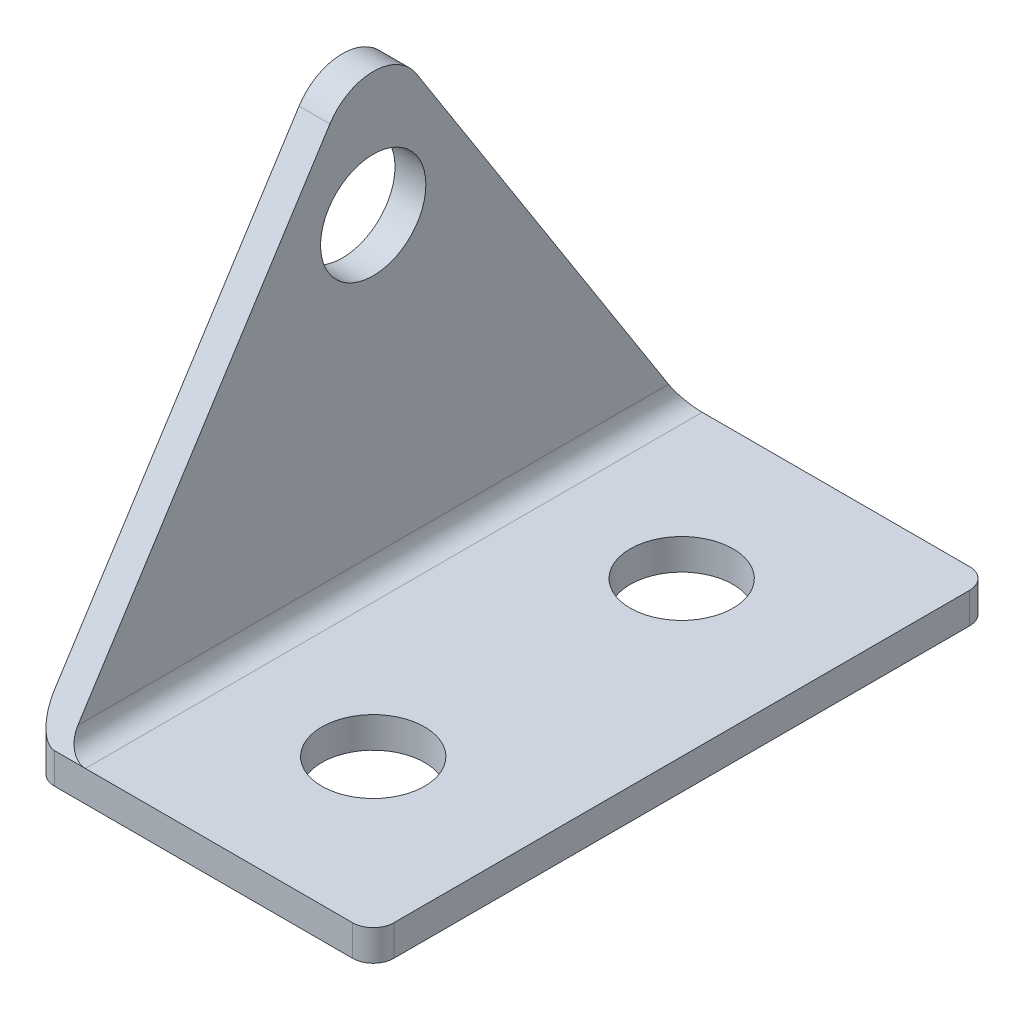
ISO-10303-21;
HEADER;
FILE_DESCRIPTION(('STEP AP214'),'2;1');
FILE_NAME('part.step','',(''),(''),'','','');
FILE_SCHEMA(('AUTOMOTIVE_DESIGN { 1 0 10303 214 1 1 1 1 }'));
ENDSEC;
DATA;
#1=APPLICATION_CONTEXT('core data for automotive mechanical design processes');
#2=APPLICATION_PROTOCOL_DEFINITION('international standard','automotive_design',2000,#1);
#3=PRODUCT_CONTEXT('',#1,'mechanical');
#4=PRODUCT('Part','Part','',(#3));
#5=PRODUCT_RELATED_PRODUCT_CATEGORY('part','',(#4));
#6=PRODUCT_DEFINITION_FORMATION('','',#4);
#7=PRODUCT_DEFINITION_CONTEXT('part definition',#1,'design');
#8=PRODUCT_DEFINITION('design','',#6,#7);
#9=PRODUCT_DEFINITION_SHAPE('','',#8);
#10=(LENGTH_UNIT() NAMED_UNIT(*) SI_UNIT(.MILLI.,.METRE.));
#11=(NAMED_UNIT(*) PLANE_ANGLE_UNIT() SI_UNIT($,.RADIAN.));
#12=(NAMED_UNIT(*) SI_UNIT($,.STERADIAN.) SOLID_ANGLE_UNIT());
#13=UNCERTAINTY_MEASURE_WITH_UNIT(LENGTH_MEASURE(1.E-05),#10,'distance_accuracy_value','');
#14=(GEOMETRIC_REPRESENTATION_CONTEXT(3) GLOBAL_UNCERTAINTY_ASSIGNED_CONTEXT((#13)) GLOBAL_UNIT_ASSIGNED_CONTEXT((#10,
#11,#12)) REPRESENTATION_CONTEXT('',''));
#15=CARTESIAN_POINT('',(0.,0.,0.));
#16=DIRECTION('',(0.,0.,1.));
#17=DIRECTION('',(1.,0.,0.));
#18=AXIS2_PLACEMENT_3D('',#15,#16,#17);
#19=CARTESIAN_POINT('',(0.,0.,38.1));
#20=DIRECTION('',(0.,1.,0.));
#21=DIRECTION('',(0.,0.,1.));
#22=AXIS2_PLACEMENT_3D('',#19,#20,#21);
#23=PLANE('',#22);
#24=CARTESIAN_POINT('',(22.86,0.,19.05));
#25=DIRECTION('',(0.,1.,0.));
#26=DIRECTION('',(0.,0.,1.));
#27=AXIS2_PLACEMENT_3D('',#24,#25,#26);
#28=CIRCLE('',#27,6.35);
#29=CARTESIAN_POINT('',(16.51,0.,19.05));
#30=VERTEX_POINT('',#29);
#31=EDGE_CURVE('E321',#30,#30,#28,.T.);
#32=ORIENTED_EDGE('',*,*,#31,.T.);
#33=EDGE_LOOP('',(#32));
#34=FACE_BOUND('',#33,.T.);
#35=CARTESIAN_POINT('',(22.86,0.,-19.05));
#36=DIRECTION('',(0.,1.,0.));
#37=DIRECTION('',(0.,0.,1.));
#38=AXIS2_PLACEMENT_3D('',#35,#36,#37);
#39=CIRCLE('',#38,6.35);
#40=CARTESIAN_POINT('',(16.51,0.,-19.05));
#41=VERTEX_POINT('',#40);
#42=EDGE_CURVE('E325',#41,#41,#39,.T.);
#43=ORIENTED_EDGE('',*,*,#42,.T.);
#44=EDGE_LOOP('',(#43));
#45=FACE_BOUND('',#44,.T.);
#46=DIRECTION('',(0.,0.,-1.));
#47=VECTOR('',#46,1.);
#48=CARTESIAN_POINT('',(0.,0.,38.1));
#49=LINE('',#48,#47);
#50=CARTESIAN_POINT('',(0.,0.,35.56));
#51=VERTEX_POINT('',#50);
#52=CARTESIAN_POINT('',(0.,0.,-35.56));
#53=VERTEX_POINT('',#52);
#54=EDGE_CURVE('E211',#51,#53,#49,.T.);
#55=ORIENTED_EDGE('',*,*,#54,.T.);
#56=CARTESIAN_POINT('',(2.54,0.,-35.56));
#57=DIRECTION('',(0.,1.,0.));
#58=DIRECTION('',(0.,0.,1.));
#59=AXIS2_PLACEMENT_3D('',#56,#57,#58);
#60=CIRCLE('',#59,2.54);
#61=CARTESIAN_POINT('',(2.54,0.,-38.1));
#62=VERTEX_POINT('',#61);
#63=EDGE_CURVE('E244',#53,#62,#60,.F.);
#64=ORIENTED_EDGE('',*,*,#63,.T.);
#65=DIRECTION('',(1.,0.,0.));
#66=VECTOR('',#65,1.);
#67=CARTESIAN_POINT('',(0.,0.,-38.1));
#68=LINE('',#67,#66);
#69=CARTESIAN_POINT('',(39.37,0.,-38.1));
#70=VERTEX_POINT('',#69);
#71=EDGE_CURVE('E201',#62,#70,#68,.T.);
#72=ORIENTED_EDGE('',*,*,#71,.T.);
#73=CARTESIAN_POINT('',(39.37,0.,-35.56));
#74=DIRECTION('',(0.,1.,0.));
#75=DIRECTION('',(0.,0.,1.));
#76=AXIS2_PLACEMENT_3D('',#73,#74,#75);
#77=CIRCLE('',#76,2.54);
#78=CARTESIAN_POINT('',(41.91,0.,-35.56));
#79=VERTEX_POINT('',#78);
#80=EDGE_CURVE('E238',#70,#79,#77,.F.);
#81=ORIENTED_EDGE('',*,*,#80,.T.);
#82=DIRECTION('',(0.,0.,1.));
#83=VECTOR('',#82,1.);
#84=CARTESIAN_POINT('',(41.91,0.,38.1));
#85=LINE('',#84,#83);
#86=CARTESIAN_POINT('',(41.91,0.,35.56));
#87=VERTEX_POINT('',#86);
#88=EDGE_CURVE('E181',#79,#87,#85,.T.);
#89=ORIENTED_EDGE('',*,*,#88,.T.);
#90=CARTESIAN_POINT('',(39.37,0.,35.56));
#91=DIRECTION('',(0.,1.,0.));
#92=DIRECTION('',(0.,0.,1.));
#93=AXIS2_PLACEMENT_3D('',#90,#91,#92);
#94=CIRCLE('',#93,2.54);
#95=CARTESIAN_POINT('',(39.37,0.,38.1));
#96=VERTEX_POINT('',#95);
#97=EDGE_CURVE('E235',#87,#96,#94,.F.);
#98=ORIENTED_EDGE('',*,*,#97,.T.);
#99=DIRECTION('',(1.,0.,0.));
#100=VECTOR('',#99,1.);
#101=CARTESIAN_POINT('',(0.,0.,38.1));
#102=LINE('',#101,#100);
#103=CARTESIAN_POINT('',(2.54,0.,38.1));
#104=VERTEX_POINT('',#103);
#105=EDGE_CURVE('E202',#104,#96,#102,.T.);
#106=ORIENTED_EDGE('',*,*,#105,.F.);
#107=CARTESIAN_POINT('',(2.54,0.,35.56));
#108=DIRECTION('',(0.,1.,0.));
#109=DIRECTION('',(0.,0.,1.));
#110=AXIS2_PLACEMENT_3D('',#107,#108,#109);
#111=CIRCLE('',#110,2.54);
#112=EDGE_CURVE('E241',#104,#51,#111,.F.);
#113=ORIENTED_EDGE('',*,*,#112,.T.);
#114=EDGE_LOOP('',(#55,#64,#72,#81,#89,#98,#106,#113));
#115=FACE_BOUND('',#114,.T.);
#116=ADVANCED_FACE('F65',(#34,#45,#115),#23,.F.);
#117=CARTESIAN_POINT('',(63.5,3.81,38.1));
#118=DIRECTION('',(0.,-1.,0.));
#119=DIRECTION('',(1.,0.,0.));
#120=AXIS2_PLACEMENT_3D('',#117,#118,#119);
#121=PLANE('',#120);
#122=CARTESIAN_POINT('',(22.86,3.80999999999999,19.05));
#123=DIRECTION('',(0.,1.,0.));
#124=DIRECTION('',(-1.,0.,0.));
#125=AXIS2_PLACEMENT_3D('',#122,#123,#124);
#126=CIRCLE('',#125,6.35);
#127=CARTESIAN_POINT('',(16.51,3.80999999999999,19.05));
#128=VERTEX_POINT('',#127);
#129=EDGE_CURVE('E329',#128,#128,#126,.T.);
#130=ORIENTED_EDGE('',*,*,#129,.F.);
#131=EDGE_LOOP('',(#130));
#132=FACE_BOUND('',#131,.T.);
#133=CARTESIAN_POINT('',(22.86,3.80999999999999,-19.05));
#134=DIRECTION('',(0.,1.,0.));
#135=DIRECTION('',(-1.,0.,0.));
#136=AXIS2_PLACEMENT_3D('',#133,#134,#135);
#137=CIRCLE('',#136,6.35);
#138=CARTESIAN_POINT('',(16.51,3.80999999999999,-19.05));
#139=VERTEX_POINT('',#138);
#140=EDGE_CURVE('E330',#139,#139,#137,.T.);
#141=ORIENTED_EDGE('',*,*,#140,.F.);
#142=EDGE_LOOP('',(#141));
#143=FACE_BOUND('',#142,.T.);
#144=DIRECTION('',(-1.,0.,0.));
#145=VECTOR('',#144,1.);
#146=CARTESIAN_POINT('',(63.5,3.81,-38.1));
#147=LINE('',#146,#145);
#148=CARTESIAN_POINT('',(39.37,3.81,-38.1));
#149=VERTEX_POINT('',#148);
#150=CARTESIAN_POINT('',(6.35000000000002,3.80999999999999,-38.1));
#151=VERTEX_POINT('',#150);
#152=EDGE_CURVE('E207',#149,#151,#147,.T.);
#153=ORIENTED_EDGE('',*,*,#152,.T.);
#154=DIRECTION('',(0.,0.,-1.));
#155=VECTOR('',#154,1.);
#156=CARTESIAN_POINT('',(6.35,3.80999999999999,38.1));
#157=LINE('',#156,#155);
#158=CARTESIAN_POINT('',(6.35,3.80999999999999,38.1));
#159=VERTEX_POINT('',#158);
#160=EDGE_CURVE('E282',#151,#159,#157,.F.);
#161=ORIENTED_EDGE('',*,*,#160,.T.);
#162=DIRECTION('',(-1.,0.,0.));
#163=VECTOR('',#162,1.);
#164=CARTESIAN_POINT('',(63.5,3.81,38.1));
#165=LINE('',#164,#163);
#166=CARTESIAN_POINT('',(39.37,3.81,38.1));
#167=VERTEX_POINT('',#166);
#168=EDGE_CURVE('E206',#167,#159,#165,.T.);
#169=ORIENTED_EDGE('',*,*,#168,.F.);
#170=CARTESIAN_POINT('',(39.37,3.81,35.56));
#171=DIRECTION('',(0.,-1.,0.));
#172=DIRECTION('',(1.,0.,0.));
#173=AXIS2_PLACEMENT_3D('',#170,#171,#172);
#174=CIRCLE('',#173,2.54);
#175=CARTESIAN_POINT('',(41.91,3.81,35.56));
#176=VERTEX_POINT('',#175);
#177=EDGE_CURVE('E274',#167,#176,#174,.F.);
#178=ORIENTED_EDGE('',*,*,#177,.T.);
#179=DIRECTION('',(0.,0.,1.));
#180=VECTOR('',#179,1.);
#181=CARTESIAN_POINT('',(41.91,3.81,38.1));
#182=LINE('',#181,#180);
#183=CARTESIAN_POINT('',(41.91,3.81,-35.56));
#184=VERTEX_POINT('',#183);
#185=EDGE_CURVE('E189',#184,#176,#182,.T.);
#186=ORIENTED_EDGE('',*,*,#185,.F.);
#187=CARTESIAN_POINT('',(39.37,3.80999999999999,-35.56));
#188=DIRECTION('',(0.,-1.,0.));
#189=DIRECTION('',(1.,0.,0.));
#190=AXIS2_PLACEMENT_3D('',#187,#188,#189);
#191=CIRCLE('',#190,2.54);
#192=EDGE_CURVE('E277',#184,#149,#191,.F.);
#193=ORIENTED_EDGE('',*,*,#192,.T.);
#194=EDGE_LOOP('',(#153,#161,#169,#178,#186,#193));
#195=FACE_BOUND('',#194,.T.);
#196=ADVANCED_FACE('F295',(#132,#143,#195),#121,.F.);
#197=CARTESIAN_POINT('',(3.81,3.80999999999999,38.1));
#198=DIRECTION('',(-1.,0.,0.));
#199=DIRECTION('',(0.,0.,1.));
#200=AXIS2_PLACEMENT_3D('',#197,#198,#199);
#201=PLANE('',#200);
#202=CARTESIAN_POINT('',(3.81,42.6920214745365,0.));
#203=DIRECTION('',(1.,0.,0.));
#204=DIRECTION('',(0.,0.,-1.));
#205=AXIS2_PLACEMENT_3D('',#202,#203,#204);
#206=CIRCLE('',#205,6.5024);
#207=CARTESIAN_POINT('',(3.80999999999999,42.6920214745365,-6.5024));
#208=VERTEX_POINT('',#207);
#209=EDGE_CURVE('E316',#208,#208,#206,.T.);
#210=ORIENTED_EDGE('',*,*,#209,.F.);
#211=EDGE_LOOP('',(#210));
#212=FACE_BOUND('',#211,.T.);
#213=DIRECTION('',(0.,0.842922209577588,-0.538035452921865));
#214=VECTOR('',#213,1.);
#215=CARTESIAN_POINT('',(3.81,18.3821164361531,28.7986490833065));
#216=LINE('',#215,#214);
#217=CARTESIAN_POINT('',(3.81,6.34999999999999,36.4787234042553));
#218=VERTEX_POINT('',#217);
#219=CARTESIAN_POINT('',(3.81,55.1143288850523,5.3525560308177));
#220=VERTEX_POINT('',#219);
#221=EDGE_CURVE('E195',#218,#220,#216,.T.);
#222=ORIENTED_EDGE('',*,*,#221,.F.);
#223=DIRECTION('',(0.,0.,-1.));
#224=VECTOR('',#223,1.);
#225=CARTESIAN_POINT('',(3.81,6.34999999999999,-38.1));
#226=LINE('',#225,#224);
#227=CARTESIAN_POINT('',(3.81,6.34999999999999,-36.4787234042553));
#228=VERTEX_POINT('',#227);
#229=EDGE_CURVE('E179',#218,#228,#226,.T.);
#230=ORIENTED_EDGE('',*,*,#229,.T.);
#231=DIRECTION('',(0.,-0.842922209577588,-0.538035452921865));
#232=VECTOR('',#231,1.);
#233=CARTESIAN_POINT('',(3.81,18.3821164361531,-28.7986490833065));
#234=LINE('',#233,#232);
#235=CARTESIAN_POINT('',(3.81,55.1143288850523,-5.35255603081767));
#236=VERTEX_POINT('',#235);
#237=EDGE_CURVE('E170',#236,#228,#234,.T.);
#238=ORIENTED_EDGE('',*,*,#237,.F.);
#239=CARTESIAN_POINT('',(3.80999999999999,51.6978037589984,0.));
#240=DIRECTION('',(-1.,0.,0.));
#241=DIRECTION('',(0.,0.,1.));
#242=AXIS2_PLACEMENT_3D('',#239,#240,#241);
#243=CIRCLE('',#242,6.35);
#244=EDGE_CURVE('E153',#236,#220,#243,.F.);
#245=ORIENTED_EDGE('',*,*,#244,.T.);
#246=EDGE_LOOP('',(#222,#230,#238,#245));
#247=FACE_BOUND('',#246,.T.);
#248=ADVANCED_FACE('F177',(#212,#247),#201,.F.);
#249=CARTESIAN_POINT('',(0.,0.,38.1));
#250=DIRECTION('',(1.,0.,0.));
#251=DIRECTION('',(0.,0.,-1.));
#252=AXIS2_PLACEMENT_3D('',#249,#250,#251);
#253=PLANE('',#252);
#254=CARTESIAN_POINT('',(0.,42.6920214745365,0.));
#255=DIRECTION('',(1.,0.,0.));
#256=DIRECTION('',(0.,0.,-1.));
#257=AXIS2_PLACEMENT_3D('',#254,#255,#256);
#258=CIRCLE('',#257,6.5024);
#259=CARTESIAN_POINT('',(0.,42.6920214745365,-6.5024));
#260=VERTEX_POINT('',#259);
#261=EDGE_CURVE('E69',#260,#260,#258,.T.);
#262=ORIENTED_EDGE('',*,*,#261,.T.);
#263=EDGE_LOOP('',(#262));
#264=FACE_BOUND('',#263,.T.);
#265=DIRECTION('',(0.,-0.842922209577588,-0.538035452921865));
#266=VECTOR('',#265,1.);
#267=CARTESIAN_POINT('',(0.,35.661305886137,-17.7693792216147));
#268=LINE('',#267,#266);
#269=CARTESIAN_POINT('',(0.,55.1143288850523,-5.35255603081768));
#270=VERTEX_POINT('',#269);
#271=CARTESIAN_POINT('',(0.,7.78933333333333,-35.56));
#272=VERTEX_POINT('',#271);
#273=EDGE_CURVE('E172',#270,#272,#268,.T.);
#274=ORIENTED_EDGE('',*,*,#273,.T.);
#275=DIRECTION('',(0.,-1.,0.));
#276=VECTOR('',#275,1.);
#277=CARTESIAN_POINT('',(0.,0.,-35.56));
#278=LINE('',#277,#276);
#279=EDGE_CURVE('E231',#272,#53,#278,.T.);
#280=ORIENTED_EDGE('',*,*,#279,.T.);
#281=ORIENTED_EDGE('',*,*,#54,.F.);
#282=DIRECTION('',(0.,-1.,0.));
#283=VECTOR('',#282,1.);
#284=CARTESIAN_POINT('',(0.,0.,35.56));
#285=LINE('',#284,#283);
#286=CARTESIAN_POINT('',(0.,7.78933333333333,35.56));
#287=VERTEX_POINT('',#286);
#288=EDGE_CURVE('E228',#51,#287,#285,.F.);
#289=ORIENTED_EDGE('',*,*,#288,.T.);
#290=DIRECTION('',(0.,0.842922209577588,-0.538035452921865));
#291=VECTOR('',#290,1.);
#292=CARTESIAN_POINT('',(0.,1.10292698616918,39.8279189449984));
#293=LINE('',#292,#291);
#294=CARTESIAN_POINT('',(0.,55.1143288850523,5.3525560308177));
#295=VERTEX_POINT('',#294);
#296=EDGE_CURVE('E198',#287,#295,#293,.T.);
#297=ORIENTED_EDGE('',*,*,#296,.T.);
#298=CARTESIAN_POINT('',(0.,51.6978037589984,0.));
#299=DIRECTION('',(1.,0.,0.));
#300=DIRECTION('',(0.,0.,-1.));
#301=AXIS2_PLACEMENT_3D('',#298,#299,#300);
#302=CIRCLE('',#301,6.35);
#303=EDGE_CURVE('E225',#295,#270,#302,.F.);
#304=ORIENTED_EDGE('',*,*,#303,.T.);
#305=EDGE_LOOP('',(#274,#280,#281,#289,#297,#304));
#306=FACE_BOUND('',#305,.T.);
#307=ADVANCED_FACE('F363',(#264,#306),#253,.F.);
#308=CARTESIAN_POINT('',(0.,0.,38.1));
#309=DIRECTION('',(0.,0.,-1.));
#310=DIRECTION('',(-1.,0.,0.));
#311=AXIS2_PLACEMENT_3D('',#308,#309,#310);
#312=PLANE('',#311);
#313=DIRECTION('',(-1.,0.,0.));
#314=VECTOR('',#313,1.);
#315=CARTESIAN_POINT('',(0.,3.80999999999999,38.1));
#316=LINE('',#315,#314);
#317=CARTESIAN_POINT('',(2.54,3.80999999999999,38.1));
#318=VERTEX_POINT('',#317);
#319=EDGE_CURVE('E174',#159,#318,#316,.T.);
#320=ORIENTED_EDGE('',*,*,#319,.T.);
#321=DIRECTION('',(0.,-1.,0.));
#322=VECTOR('',#321,1.);
#323=CARTESIAN_POINT('',(2.54,0.,38.1));
#324=LINE('',#323,#322);
#325=EDGE_CURVE('E260',#318,#104,#324,.T.);
#326=ORIENTED_EDGE('',*,*,#325,.T.);
#327=ORIENTED_EDGE('',*,*,#105,.T.);
#328=DIRECTION('',(0.,1.,0.));
#329=VECTOR('',#328,1.);
#330=CARTESIAN_POINT('',(39.37,0.,38.1));
#331=LINE('',#330,#329);
#332=EDGE_CURVE('E256',#96,#167,#331,.T.);
#333=ORIENTED_EDGE('',*,*,#332,.T.);
#334=ORIENTED_EDGE('',*,*,#168,.T.);
#335=EDGE_LOOP('',(#320,#326,#327,#333,#334));
#336=FACE_BOUND('',#335,.T.);
#337=ADVANCED_FACE('F297',(#336),#312,.F.);
#338=CARTESIAN_POINT('',(0.,0.,-38.1));
#339=DIRECTION('',(0.,0.,-1.));
#340=DIRECTION('',(-1.,0.,0.));
#341=AXIS2_PLACEMENT_3D('',#338,#339,#340);
#342=PLANE('',#341);
#343=ORIENTED_EDGE('',*,*,#71,.F.);
#344=DIRECTION('',(0.,-1.,0.));
#345=VECTOR('',#344,1.);
#346=CARTESIAN_POINT('',(2.54,3.80999999999999,-38.1));
#347=LINE('',#346,#345);
#348=CARTESIAN_POINT('',(2.53999999999997,3.80999999999999,-38.1));
#349=VERTEX_POINT('',#348);
#350=EDGE_CURVE('E250',#62,#349,#347,.F.);
#351=ORIENTED_EDGE('',*,*,#350,.T.);
#352=DIRECTION('',(1.,0.,0.));
#353=VECTOR('',#352,1.);
#354=CARTESIAN_POINT('',(-72.39,3.80999999999999,-38.1));
#355=LINE('',#354,#353);
#356=EDGE_CURVE('E82',#349,#151,#355,.T.);
#357=ORIENTED_EDGE('',*,*,#356,.T.);
#358=ORIENTED_EDGE('',*,*,#152,.F.);
#359=DIRECTION('',(0.,1.,0.));
#360=VECTOR('',#359,1.);
#361=CARTESIAN_POINT('',(39.37,0.,-38.1));
#362=LINE('',#361,#360);
#363=EDGE_CURVE('E247',#149,#70,#362,.F.);
#364=ORIENTED_EDGE('',*,*,#363,.T.);
#365=EDGE_LOOP('',(#343,#351,#357,#358,#364));
#366=FACE_BOUND('',#365,.T.);
#367=ADVANCED_FACE('F374',(#366),#342,.T.);
#368=CARTESIAN_POINT('',(-72.39,18.3821164361531,28.7986490833065));
#369=DIRECTION('',(0.,-0.538035452921865,-0.842922209577588));
#370=DIRECTION('',(0.,0.842922209577589,-0.538035452921865));
#371=AXIS2_PLACEMENT_3D('',#368,#369,#370);
#372=PLANE('',#371);
#373=ORIENTED_EDGE('',*,*,#296,.F.);
#374=CARTESIAN_POINT('',(2.54,7.78933333333332,35.56));
#375=DIRECTION('',(0.,-0.538035452921865,-0.842922209577588));
#376=DIRECTION('',(0.,-0.842922209577588,0.538035452921865));
#377=AXIS2_PLACEMENT_3D('',#374,#375,#376);
#378=ELLIPSE('',#377,4.72087849640062,2.54);
#379=EDGE_CURVE('E264',#287,#318,#378,.F.);
#380=ORIENTED_EDGE('',*,*,#379,.T.);
#381=ORIENTED_EDGE('',*,*,#319,.F.);
#382=CARTESIAN_POINT('',(6.35,6.34999999999999,36.4787234042553));
#383=DIRECTION('',(0.,-0.538035452921865,-0.842922209577588));
#384=DIRECTION('',(0.,-0.842922209577588,0.538035452921865));
#385=AXIS2_PLACEMENT_3D('',#382,#383,#384);
#386=ELLIPSE('',#385,3.01332669983018,2.54);
#387=EDGE_CURVE('E12',#159,#218,#386,.T.);
#388=ORIENTED_EDGE('',*,*,#387,.T.);
#389=ORIENTED_EDGE('',*,*,#221,.T.);
#390=DIRECTION('',(1.,0.,0.));
#391=VECTOR('',#390,1.);
#392=CARTESIAN_POINT('',(-72.39,55.1143288850523,5.35255603081769));
#393=LINE('',#392,#391);
#394=EDGE_CURVE('E159',#220,#295,#393,.F.);
#395=ORIENTED_EDGE('',*,*,#394,.T.);
#396=EDGE_LOOP('',(#373,#380,#381,#388,#389,#395));
#397=FACE_BOUND('',#396,.T.);
#398=ADVANCED_FACE('F370',(#397),#372,.F.);
#399=CARTESIAN_POINT('',(-72.39,18.3821164361531,-28.7986490833065));
#400=DIRECTION('',(0.,-0.538035452921865,0.842922209577588));
#401=DIRECTION('',(0.,-0.842922209577588,-0.538035452921865));
#402=AXIS2_PLACEMENT_3D('',#399,#400,#401);
#403=PLANE('',#402);
#404=ORIENTED_EDGE('',*,*,#356,.F.);
#405=CARTESIAN_POINT('',(2.54,7.78933333333333,-35.56));
#406=DIRECTION('',(0.,-0.538035452921865,0.842922209577588));
#407=DIRECTION('',(0.,0.842922209577588,0.538035452921865));
#408=AXIS2_PLACEMENT_3D('',#405,#406,#407);
#409=ELLIPSE('',#408,4.72087849640062,2.54);
#410=EDGE_CURVE('E253',#349,#272,#409,.F.);
#411=ORIENTED_EDGE('',*,*,#410,.T.);
#412=ORIENTED_EDGE('',*,*,#273,.F.);
#413=DIRECTION('',(1.,0.,0.));
#414=VECTOR('',#413,1.);
#415=CARTESIAN_POINT('',(-72.39,55.1143288850523,-5.35255603081768));
#416=LINE('',#415,#414);
#417=EDGE_CURVE('E157',#270,#236,#416,.T.);
#418=ORIENTED_EDGE('',*,*,#417,.T.);
#419=ORIENTED_EDGE('',*,*,#237,.T.);
#420=CARTESIAN_POINT('',(6.35,6.34999999999999,-36.4787234042553));
#421=DIRECTION('',(0.,-0.538035452921865,0.842922209577588));
#422=DIRECTION('',(0.,0.842922209577588,0.538035452921865));
#423=AXIS2_PLACEMENT_3D('',#420,#421,#422);
#424=ELLIPSE('',#423,3.01332669983018,2.54);
#425=EDGE_CURVE('E76',#228,#151,#424,.T.);
#426=ORIENTED_EDGE('',*,*,#425,.T.);
#427=EDGE_LOOP('',(#404,#411,#412,#418,#419,#426));
#428=FACE_BOUND('',#427,.T.);
#429=ADVANCED_FACE('F168',(#428),#403,.F.);
#430=CARTESIAN_POINT('',(-72.39,51.6978037589984,0.));
#431=DIRECTION('',(1.,0.,0.));
#432=DIRECTION('',(0.,0.,-1.));
#433=AXIS2_PLACEMENT_3D('',#430,#431,#432);
#434=CYLINDRICAL_SURFACE('',#433,6.35);
#435=ORIENTED_EDGE('',*,*,#303,.F.);
#436=ORIENTED_EDGE('',*,*,#394,.F.);
#437=ORIENTED_EDGE('',*,*,#244,.F.);
#438=ORIENTED_EDGE('',*,*,#417,.F.);
#439=EDGE_LOOP('',(#435,#436,#437,#438));
#440=FACE_BOUND('',#439,.T.);
#441=ADVANCED_FACE('F156',(#440),#434,.T.);
#442=CARTESIAN_POINT('',(41.91,-72.39,38.1));
#443=DIRECTION('',(-1.,0.,0.));
#444=DIRECTION('',(0.,-1.,0.));
#445=AXIS2_PLACEMENT_3D('',#442,#443,#444);
#446=PLANE('',#445);
#447=ORIENTED_EDGE('',*,*,#88,.F.);
#448=DIRECTION('',(0.,1.,0.));
#449=VECTOR('',#448,1.);
#450=CARTESIAN_POINT('',(41.91,3.80999999999999,-35.56));
#451=LINE('',#450,#449);
#452=EDGE_CURVE('E270',#79,#184,#451,.T.);
#453=ORIENTED_EDGE('',*,*,#452,.T.);
#454=ORIENTED_EDGE('',*,*,#185,.T.);
#455=DIRECTION('',(0.,1.,0.));
#456=VECTOR('',#455,1.);
#457=CARTESIAN_POINT('',(41.91,-72.39,35.56));
#458=LINE('',#457,#456);
#459=EDGE_CURVE('E267',#176,#87,#458,.F.);
#460=ORIENTED_EDGE('',*,*,#459,.T.);
#461=EDGE_LOOP('',(#447,#453,#454,#460));
#462=FACE_BOUND('',#461,.T.);
#463=ADVANCED_FACE('F309',(#462),#446,.F.);
#464=CARTESIAN_POINT('',(2.54,0.,-35.56));
#465=DIRECTION('',(0.,1.,0.));
#466=DIRECTION('',(0.,0.,1.));
#467=AXIS2_PLACEMENT_3D('',#464,#465,#466);
#468=CYLINDRICAL_SURFACE('',#467,2.54);
#469=ORIENTED_EDGE('',*,*,#410,.F.);
#470=ORIENTED_EDGE('',*,*,#350,.F.);
#471=ORIENTED_EDGE('',*,*,#63,.F.);
#472=ORIENTED_EDGE('',*,*,#279,.F.);
#473=EDGE_LOOP('',(#469,#470,#471,#472));
#474=FACE_BOUND('',#473,.T.);
#475=ADVANCED_FACE('F372',(#474),#468,.T.);
#476=CARTESIAN_POINT('',(2.54,0.,35.56));
#477=DIRECTION('',(0.,-1.,0.));
#478=DIRECTION('',(0.,0.,-1.));
#479=AXIS2_PLACEMENT_3D('',#476,#477,#478);
#480=CYLINDRICAL_SURFACE('',#479,2.54);
#481=ORIENTED_EDGE('',*,*,#379,.F.);
#482=ORIENTED_EDGE('',*,*,#288,.F.);
#483=ORIENTED_EDGE('',*,*,#112,.F.);
#484=ORIENTED_EDGE('',*,*,#325,.F.);
#485=EDGE_LOOP('',(#481,#482,#483,#484));
#486=FACE_BOUND('',#485,.T.);
#487=ADVANCED_FACE('F368',(#486),#480,.T.);
#488=CARTESIAN_POINT('',(39.37,-72.39,-35.56));
#489=DIRECTION('',(0.,-1.,0.));
#490=DIRECTION('',(1.,0.,0.));
#491=AXIS2_PLACEMENT_3D('',#488,#489,#490);
#492=CYLINDRICAL_SURFACE('',#491,2.54);
#493=ORIENTED_EDGE('',*,*,#80,.F.);
#494=ORIENTED_EDGE('',*,*,#363,.F.);
#495=ORIENTED_EDGE('',*,*,#192,.F.);
#496=ORIENTED_EDGE('',*,*,#452,.F.);
#497=EDGE_LOOP('',(#493,#494,#495,#496));
#498=FACE_BOUND('',#497,.T.);
#499=ADVANCED_FACE('F378',(#498),#492,.T.);
#500=CARTESIAN_POINT('',(39.37,0.,35.56));
#501=DIRECTION('',(0.,1.,0.));
#502=DIRECTION('',(-1.,0.,0.));
#503=AXIS2_PLACEMENT_3D('',#500,#501,#502);
#504=CYLINDRICAL_SURFACE('',#503,2.54);
#505=ORIENTED_EDGE('',*,*,#97,.F.);
#506=ORIENTED_EDGE('',*,*,#459,.F.);
#507=ORIENTED_EDGE('',*,*,#177,.F.);
#508=ORIENTED_EDGE('',*,*,#332,.F.);
#509=EDGE_LOOP('',(#505,#506,#507,#508));
#510=FACE_BOUND('',#509,.T.);
#511=ADVANCED_FACE('F303',(#510),#504,.T.);
#512=CARTESIAN_POINT('',(6.35,6.34999999999999,38.1));
#513=DIRECTION('',(0.,0.,1.));
#514=DIRECTION('',(1.,0.,0.));
#515=AXIS2_PLACEMENT_3D('',#512,#513,#514);
#516=CYLINDRICAL_SURFACE('',#515,2.54);
#517=ORIENTED_EDGE('',*,*,#387,.F.);
#518=ORIENTED_EDGE('',*,*,#160,.F.);
#519=ORIENTED_EDGE('',*,*,#425,.F.);
#520=ORIENTED_EDGE('',*,*,#229,.F.);
#521=EDGE_LOOP('',(#517,#518,#519,#520));
#522=FACE_BOUND('',#521,.T.);
#523=ADVANCED_FACE('F67',(#522),#516,.F.);
#524=CARTESIAN_POINT('',(-72.39,42.6920214745365,0.));
#525=DIRECTION('',(1.,0.,0.));
#526=DIRECTION('',(0.,0.,-1.));
#527=AXIS2_PLACEMENT_3D('',#524,#525,#526);
#528=CYLINDRICAL_SURFACE('',#527,6.5024);
#529=CARTESIAN_POINT('',(3.80999999999999,42.6920214745365,-6.5024));
#530=CARTESIAN_POINT('',(3.77031249999999,42.6920214745365,-6.5024));
#531=CARTESIAN_POINT('',(3.73062499999999,42.6920214745365,-6.5024));
#532=CARTESIAN_POINT('',(3.65124999999999,42.6920214745365,-6.5024));
#533=CARTESIAN_POINT('',(3.61156249999999,42.6920214745365,-6.5024));
#534=CARTESIAN_POINT('',(3.53218749999999,42.6920214745365,-6.5024));
#535=CARTESIAN_POINT('',(3.4925,42.6920214745365,-6.5024));
#536=CARTESIAN_POINT('',(3.413125,42.6920214745365,-6.5024));
#537=CARTESIAN_POINT('',(3.3734375,42.6920214745365,-6.5024));
#538=CARTESIAN_POINT('',(3.2940625,42.6920214745365,-6.5024));
#539=CARTESIAN_POINT('',(3.25437499999999,42.6920214745365,-6.5024));
#540=CARTESIAN_POINT('',(3.17499999999999,42.6920214745365,-6.5024));
#541=CARTESIAN_POINT('',(3.13531249999999,42.6920214745365,-6.5024));
#542=CARTESIAN_POINT('',(3.05593749999999,42.6920214745365,-6.5024));
#543=CARTESIAN_POINT('',(3.01624999999999,42.6920214745365,-6.5024));
#544=CARTESIAN_POINT('',(2.93687499999999,42.6920214745365,-6.5024));
#545=CARTESIAN_POINT('',(2.8971875,42.6920214745365,-6.5024));
#546=CARTESIAN_POINT('',(2.8178125,42.6920214745365,-6.5024));
#547=CARTESIAN_POINT('',(2.778125,42.6920214745365,-6.5024));
#548=CARTESIAN_POINT('',(2.69875,42.6920214745365,-6.5024));
#549=CARTESIAN_POINT('',(2.65906249999999,42.6920214745365,-6.5024));
#550=CARTESIAN_POINT('',(2.57968749999999,42.6920214745365,-6.5024));
#551=CARTESIAN_POINT('',(2.53999999999999,42.6920214745365,-6.5024));
#552=CARTESIAN_POINT('',(2.46062499999999,42.6920214745365,-6.5024));
#553=CARTESIAN_POINT('',(2.42093749999999,42.6920214745365,-6.5024));
#554=CARTESIAN_POINT('',(2.34156249999999,42.6920214745365,-6.5024));
#555=CARTESIAN_POINT('',(2.30187499999999,42.6920214745365,-6.5024));
#556=CARTESIAN_POINT('',(2.22249999999999,42.6920214745365,-6.5024));
#557=CARTESIAN_POINT('',(2.18281249999999,42.6920214745365,-6.5024));
#558=CARTESIAN_POINT('',(2.10343749999999,42.6920214745365,-6.5024));
#559=CARTESIAN_POINT('',(2.06374999999999,42.6920214745365,-6.5024));
#560=CARTESIAN_POINT('',(1.98437499999999,42.6920214745365,-6.5024));
#561=CARTESIAN_POINT('',(1.94468749999999,42.6920214745365,-6.5024));
#562=CARTESIAN_POINT('',(1.86531249999999,42.6920214745365,-6.5024));
#563=CARTESIAN_POINT('',(1.82562499999999,42.6920214745365,-6.5024));
#564=CARTESIAN_POINT('',(1.74624999999999,42.6920214745365,-6.5024));
#565=CARTESIAN_POINT('',(1.70656249999999,42.6920214745365,-6.5024));
#566=CARTESIAN_POINT('',(1.62718749999999,42.6920214745365,-6.5024));
#567=CARTESIAN_POINT('',(1.58749999999999,42.6920214745365,-6.5024));
#568=CARTESIAN_POINT('',(1.50812499999999,42.6920214745365,-6.5024));
#569=CARTESIAN_POINT('',(1.46843749999999,42.6920214745365,-6.5024));
#570=CARTESIAN_POINT('',(1.38906249999999,42.6920214745365,-6.5024));
#571=CARTESIAN_POINT('',(1.34937499999999,42.6920214745365,-6.5024));
#572=CARTESIAN_POINT('',(1.26999999999999,42.6920214745365,-6.5024));
#573=CARTESIAN_POINT('',(1.23031249999999,42.6920214745365,-6.5024));
#574=CARTESIAN_POINT('',(1.15093749999999,42.6920214745365,-6.5024));
#575=CARTESIAN_POINT('',(1.11124999999998,42.6920214745365,-6.5024));
#576=CARTESIAN_POINT('',(1.03187499999998,42.6920214745365,-6.5024));
#577=CARTESIAN_POINT('',(0.992187499999982,42.6920214745365,-6.5024));
#578=CARTESIAN_POINT('',(0.912812499999985,42.6920214745365,-6.5024));
#579=CARTESIAN_POINT('',(0.873124999999988,42.6920214745365,-6.5024));
#580=CARTESIAN_POINT('',(0.793749999999991,42.6920214745365,-6.5024));
#581=CARTESIAN_POINT('',(0.75406249999999,42.6920214745365,-6.5024));
#582=CARTESIAN_POINT('',(0.674687499999988,42.6920214745365,-6.5024));
#583=CARTESIAN_POINT('',(0.634999999999987,42.6920214745365,-6.5024));
#584=CARTESIAN_POINT('',(0.555624999999985,42.6920214745365,-6.5024));
#585=CARTESIAN_POINT('',(0.515937499999985,42.6920214745365,-6.5024));
#586=CARTESIAN_POINT('',(0.436562499999983,42.6920214745365,-6.5024));
#587=CARTESIAN_POINT('',(0.396874999999982,42.6920214745365,-6.5024));
#588=CARTESIAN_POINT('',(0.317499999999984,42.6920214745365,-6.5024));
#589=CARTESIAN_POINT('',(0.277812499999988,42.6920214745365,-6.5024));
#590=CARTESIAN_POINT('',(0.198437499999991,42.6920214745365,-6.5024));
#591=CARTESIAN_POINT('',(0.15874999999999,42.6920214745365,-6.5024));
#592=CARTESIAN_POINT('',(0.079374999999988,42.6920214745365,-6.5024));
#593=CARTESIAN_POINT('',(0.0396874999999871,42.6920214745365,-6.5024));
#594=CARTESIAN_POINT('',(0.,42.6920214745365,-6.5024));
#595=B_SPLINE_CURVE_WITH_KNOTS('',3,(#529,#530,#531,#532,#533,#534,#535,#536,#537,#538,#539,
#540,#541,#542,#543,#544,#545,#546,#547,#548,#549,#550,#551,#552,#553,#554,#555,#556,#557,#558,
#559,#560,#561,#562,#563,#564,#565,#566,#567,#568,#569,#570,#571,#572,#573,#574,#575,#576,#577,
#578,#579,#580,#581,#582,#583,#584,#585,#586,#587,#588,#589,#590,#591,#592,#593,#594),
.UNSPECIFIED.,.F.,.F.,(4,2,2,2,2,2,2,2,2,2,2,2,2,2,2,2,2,2,2,2,2,2,2,2,2,2,2,2,2,2,2,2,4),(0.,
0.119062500000003,0.238125000000006,0.357187499999995,0.476249999999998,0.5953125,
0.714375000000003,0.833437500000006,0.952499999999995,1.0715625,1.190625,1.3096875,
1.42875000000001,1.54781250000001,1.666875,1.7859375,1.905,2.02406250000001,2.14312500000001,
2.2621875,2.38125,2.5003125,2.61937500000001,2.73843750000001,2.85750000000001,2.9765625,
3.095625,3.21468750000001,3.33375000000001,3.45281250000001,3.571875,3.6909375,
3.81000000000001),.UNSPECIFIED.);
#596=EDGE_CURVE('BSEAM351',#208,#260,#595,.T.);
#597=ORIENTED_EDGE('',*,*,#209,.T.);
#598=ORIENTED_EDGE('',*,*,#261,.F.);
#599=ORIENTED_EDGE('',*,*,#596,.T.);
#600=ORIENTED_EDGE('',*,*,#596,.F.);
#601=EDGE_LOOP('',(#597,#599,#598,#600));
#602=FACE_BOUND('',#601,.T.);
#603=ADVANCED_FACE('F351',(#602),#528,.F.);
#604=CARTESIAN_POINT('',(22.86,-72.39,-19.05));
#605=DIRECTION('',(0.,1.,0.));
#606=DIRECTION('',(-1.,0.,0.));
#607=AXIS2_PLACEMENT_3D('',#604,#605,#606);
#608=CYLINDRICAL_SURFACE('',#607,6.35);
#609=CARTESIAN_POINT('',(16.51,3.80999999999999,-19.05));
#610=CARTESIAN_POINT('',(16.51,3.77031249999999,-19.05));
#611=CARTESIAN_POINT('',(16.51,3.73062499999999,-19.05));
#612=CARTESIAN_POINT('',(16.51,3.65124999999999,-19.05));
#613=CARTESIAN_POINT('',(16.51,3.61156249999999,-19.05));
#614=CARTESIAN_POINT('',(16.51,3.53218749999999,-19.05));
#615=CARTESIAN_POINT('',(16.51,3.4925,-19.05));
#616=CARTESIAN_POINT('',(16.51,3.413125,-19.05));
#617=CARTESIAN_POINT('',(16.51,3.3734375,-19.05));
#618=CARTESIAN_POINT('',(16.51,3.2940625,-19.05));
#619=CARTESIAN_POINT('',(16.51,3.25437499999999,-19.05));
#620=CARTESIAN_POINT('',(16.51,3.17499999999999,-19.05));
#621=CARTESIAN_POINT('',(16.51,3.13531249999999,-19.05));
#622=CARTESIAN_POINT('',(16.51,3.05593749999999,-19.05));
#623=CARTESIAN_POINT('',(16.51,3.01624999999999,-19.05));
#624=CARTESIAN_POINT('',(16.51,2.93687499999999,-19.05));
#625=CARTESIAN_POINT('',(16.51,2.8971875,-19.05));
#626=CARTESIAN_POINT('',(16.51,2.8178125,-19.05));
#627=CARTESIAN_POINT('',(16.51,2.778125,-19.05));
#628=CARTESIAN_POINT('',(16.51,2.69875,-19.05));
#629=CARTESIAN_POINT('',(16.51,2.65906249999999,-19.05));
#630=CARTESIAN_POINT('',(16.51,2.57968749999999,-19.05));
#631=CARTESIAN_POINT('',(16.51,2.53999999999999,-19.05));
#632=CARTESIAN_POINT('',(16.51,2.46062499999999,-19.05));
#633=CARTESIAN_POINT('',(16.51,2.42093749999999,-19.05));
#634=CARTESIAN_POINT('',(16.51,2.34156249999999,-19.05));
#635=CARTESIAN_POINT('',(16.51,2.30187499999999,-19.05));
#636=CARTESIAN_POINT('',(16.51,2.22249999999999,-19.05));
#637=CARTESIAN_POINT('',(16.51,2.18281249999999,-19.05));
#638=CARTESIAN_POINT('',(16.51,2.10343749999999,-19.05));
#639=CARTESIAN_POINT('',(16.51,2.06374999999999,-19.05));
#640=CARTESIAN_POINT('',(16.51,1.98437499999999,-19.05));
#641=CARTESIAN_POINT('',(16.51,1.94468749999999,-19.05));
#642=CARTESIAN_POINT('',(16.51,1.86531249999999,-19.05));
#643=CARTESIAN_POINT('',(16.51,1.82562499999999,-19.05));
#644=CARTESIAN_POINT('',(16.51,1.74624999999999,-19.05));
#645=CARTESIAN_POINT('',(16.51,1.70656249999999,-19.05));
#646=CARTESIAN_POINT('',(16.51,1.62718749999999,-19.05));
#647=CARTESIAN_POINT('',(16.51,1.58749999999999,-19.05));
#648=CARTESIAN_POINT('',(16.51,1.50812499999999,-19.05));
#649=CARTESIAN_POINT('',(16.51,1.46843749999999,-19.05));
#650=CARTESIAN_POINT('',(16.51,1.38906249999999,-19.05));
#651=CARTESIAN_POINT('',(16.51,1.34937499999999,-19.05));
#652=CARTESIAN_POINT('',(16.51,1.26999999999999,-19.05));
#653=CARTESIAN_POINT('',(16.51,1.23031249999999,-19.05));
#654=CARTESIAN_POINT('',(16.51,1.15093749999999,-19.05));
#655=CARTESIAN_POINT('',(16.51,1.11124999999998,-19.05));
#656=CARTESIAN_POINT('',(16.51,1.03187499999998,-19.05));
#657=CARTESIAN_POINT('',(16.51,0.992187499999982,-19.05));
#658=CARTESIAN_POINT('',(16.51,0.912812499999985,-19.05));
#659=CARTESIAN_POINT('',(16.51,0.873124999999988,-19.05));
#660=CARTESIAN_POINT('',(16.51,0.793749999999991,-19.05));
#661=CARTESIAN_POINT('',(16.51,0.75406249999999,-19.05));
#662=CARTESIAN_POINT('',(16.51,0.674687499999988,-19.05));
#663=CARTESIAN_POINT('',(16.51,0.634999999999987,-19.05));
#664=CARTESIAN_POINT('',(16.51,0.555624999999985,-19.05));
#665=CARTESIAN_POINT('',(16.51,0.515937499999985,-19.05));
#666=CARTESIAN_POINT('',(16.51,0.436562499999983,-19.05));
#667=CARTESIAN_POINT('',(16.51,0.396874999999982,-19.05));
#668=CARTESIAN_POINT('',(16.51,0.317499999999984,-19.05));
#669=CARTESIAN_POINT('',(16.51,0.277812499999988,-19.05));
#670=CARTESIAN_POINT('',(16.51,0.198437499999991,-19.05));
#671=CARTESIAN_POINT('',(16.51,0.15874999999999,-19.05));
#672=CARTESIAN_POINT('',(16.51,0.079374999999988,-19.05));
#673=CARTESIAN_POINT('',(16.51,0.0396874999999871,-19.05));
#674=CARTESIAN_POINT('',(16.51,0.,-19.05));
#675=B_SPLINE_CURVE_WITH_KNOTS('',3,(#609,#610,#611,#612,#613,#614,#615,#616,#617,#618,#619,
#620,#621,#622,#623,#624,#625,#626,#627,#628,#629,#630,#631,#632,#633,#634,#635,#636,#637,#638,
#639,#640,#641,#642,#643,#644,#645,#646,#647,#648,#649,#650,#651,#652,#653,#654,#655,#656,#657,
#658,#659,#660,#661,#662,#663,#664,#665,#666,#667,#668,#669,#670,#671,#672,#673,#674),
.UNSPECIFIED.,.F.,.F.,(4,2,2,2,2,2,2,2,2,2,2,2,2,2,2,2,2,2,2,2,2,2,2,2,2,2,2,2,2,2,2,2,4),(0.,
0.119062500000003,0.238125000000006,0.357187499999995,0.476249999999998,0.5953125,
0.714375000000003,0.833437500000006,0.952499999999995,1.0715625,1.190625,1.3096875,
1.42875000000001,1.54781250000001,1.666875,1.7859375,1.905,2.02406250000001,2.14312500000001,
2.2621875,2.38125,2.5003125,2.61937500000001,2.73843750000001,2.85750000000001,2.9765625,
3.095625,3.21468750000001,3.33375000000001,3.45281250000001,3.571875,3.6909375,
3.81000000000001),.UNSPECIFIED.);
#676=EDGE_CURVE('BSEAM348',#139,#41,#675,.T.);
#677=ORIENTED_EDGE('',*,*,#140,.T.);
#678=ORIENTED_EDGE('',*,*,#42,.F.);
#679=ORIENTED_EDGE('',*,*,#676,.T.);
#680=ORIENTED_EDGE('',*,*,#676,.F.);
#681=EDGE_LOOP('',(#677,#679,#678,#680));
#682=FACE_BOUND('',#681,.T.);
#683=ADVANCED_FACE('F348',(#682),#608,.F.);
#684=CARTESIAN_POINT('',(22.86,-72.39,19.05));
#685=DIRECTION('',(0.,1.,0.));
#686=DIRECTION('',(-1.,0.,0.));
#687=AXIS2_PLACEMENT_3D('',#684,#685,#686);
#688=CYLINDRICAL_SURFACE('',#687,6.35);
#689=CARTESIAN_POINT('',(16.51,3.80999999999999,19.05));
#690=CARTESIAN_POINT('',(16.51,3.77031249999999,19.05));
#691=CARTESIAN_POINT('',(16.51,3.73062499999999,19.05));
#692=CARTESIAN_POINT('',(16.51,3.65124999999999,19.05));
#693=CARTESIAN_POINT('',(16.51,3.61156249999999,19.05));
#694=CARTESIAN_POINT('',(16.51,3.53218749999999,19.05));
#695=CARTESIAN_POINT('',(16.51,3.4925,19.05));
#696=CARTESIAN_POINT('',(16.51,3.413125,19.05));
#697=CARTESIAN_POINT('',(16.51,3.3734375,19.05));
#698=CARTESIAN_POINT('',(16.51,3.2940625,19.05));
#699=CARTESIAN_POINT('',(16.51,3.25437499999999,19.05));
#700=CARTESIAN_POINT('',(16.51,3.17499999999999,19.05));
#701=CARTESIAN_POINT('',(16.51,3.13531249999999,19.05));
#702=CARTESIAN_POINT('',(16.51,3.05593749999999,19.05));
#703=CARTESIAN_POINT('',(16.51,3.01624999999999,19.05));
#704=CARTESIAN_POINT('',(16.51,2.93687499999999,19.05));
#705=CARTESIAN_POINT('',(16.51,2.8971875,19.05));
#706=CARTESIAN_POINT('',(16.51,2.8178125,19.05));
#707=CARTESIAN_POINT('',(16.51,2.778125,19.05));
#708=CARTESIAN_POINT('',(16.51,2.69875,19.05));
#709=CARTESIAN_POINT('',(16.51,2.65906249999999,19.05));
#710=CARTESIAN_POINT('',(16.51,2.57968749999999,19.05));
#711=CARTESIAN_POINT('',(16.51,2.53999999999999,19.05));
#712=CARTESIAN_POINT('',(16.51,2.46062499999999,19.05));
#713=CARTESIAN_POINT('',(16.51,2.42093749999999,19.05));
#714=CARTESIAN_POINT('',(16.51,2.34156249999999,19.05));
#715=CARTESIAN_POINT('',(16.51,2.30187499999999,19.05));
#716=CARTESIAN_POINT('',(16.51,2.22249999999999,19.05));
#717=CARTESIAN_POINT('',(16.51,2.18281249999999,19.05));
#718=CARTESIAN_POINT('',(16.51,2.10343749999999,19.05));
#719=CARTESIAN_POINT('',(16.51,2.06374999999999,19.05));
#720=CARTESIAN_POINT('',(16.51,1.98437499999999,19.05));
#721=CARTESIAN_POINT('',(16.51,1.94468749999999,19.05));
#722=CARTESIAN_POINT('',(16.51,1.86531249999999,19.05));
#723=CARTESIAN_POINT('',(16.51,1.82562499999999,19.05));
#724=CARTESIAN_POINT('',(16.51,1.74624999999999,19.05));
#725=CARTESIAN_POINT('',(16.51,1.70656249999999,19.05));
#726=CARTESIAN_POINT('',(16.51,1.62718749999999,19.05));
#727=CARTESIAN_POINT('',(16.51,1.58749999999999,19.05));
#728=CARTESIAN_POINT('',(16.51,1.50812499999999,19.05));
#729=CARTESIAN_POINT('',(16.51,1.46843749999999,19.05));
#730=CARTESIAN_POINT('',(16.51,1.38906249999999,19.05));
#731=CARTESIAN_POINT('',(16.51,1.34937499999999,19.05));
#732=CARTESIAN_POINT('',(16.51,1.26999999999999,19.05));
#733=CARTESIAN_POINT('',(16.51,1.23031249999999,19.05));
#734=CARTESIAN_POINT('',(16.51,1.15093749999999,19.05));
#735=CARTESIAN_POINT('',(16.51,1.11124999999998,19.05));
#736=CARTESIAN_POINT('',(16.51,1.03187499999998,19.05));
#737=CARTESIAN_POINT('',(16.51,0.992187499999982,19.05));
#738=CARTESIAN_POINT('',(16.51,0.912812499999985,19.05));
#739=CARTESIAN_POINT('',(16.51,0.873124999999988,19.05));
#740=CARTESIAN_POINT('',(16.51,0.793749999999991,19.05));
#741=CARTESIAN_POINT('',(16.51,0.75406249999999,19.05));
#742=CARTESIAN_POINT('',(16.51,0.674687499999988,19.05));
#743=CARTESIAN_POINT('',(16.51,0.634999999999987,19.05));
#744=CARTESIAN_POINT('',(16.51,0.555624999999985,19.05));
#745=CARTESIAN_POINT('',(16.51,0.515937499999985,19.05));
#746=CARTESIAN_POINT('',(16.51,0.436562499999983,19.05));
#747=CARTESIAN_POINT('',(16.51,0.396874999999982,19.05));
#748=CARTESIAN_POINT('',(16.51,0.317499999999984,19.05));
#749=CARTESIAN_POINT('',(16.51,0.277812499999988,19.05));
#750=CARTESIAN_POINT('',(16.51,0.198437499999991,19.05));
#751=CARTESIAN_POINT('',(16.51,0.15874999999999,19.05));
#752=CARTESIAN_POINT('',(16.51,0.079374999999988,19.05));
#753=CARTESIAN_POINT('',(16.51,0.0396874999999871,19.05));
#754=CARTESIAN_POINT('',(16.51,0.,19.05));
#755=B_SPLINE_CURVE_WITH_KNOTS('',3,(#689,#690,#691,#692,#693,#694,#695,#696,#697,#698,#699,
#700,#701,#702,#703,#704,#705,#706,#707,#708,#709,#710,#711,#712,#713,#714,#715,#716,#717,#718,
#719,#720,#721,#722,#723,#724,#725,#726,#727,#728,#729,#730,#731,#732,#733,#734,#735,#736,#737,
#738,#739,#740,#741,#742,#743,#744,#745,#746,#747,#748,#749,#750,#751,#752,#753,#754),
.UNSPECIFIED.,.F.,.F.,(4,2,2,2,2,2,2,2,2,2,2,2,2,2,2,2,2,2,2,2,2,2,2,2,2,2,2,2,2,2,2,2,4),(0.,
0.119062500000003,0.238125000000006,0.357187499999995,0.476249999999998,0.5953125,
0.714375000000003,0.833437500000006,0.952499999999995,1.0715625,1.190625,1.3096875,
1.42875000000001,1.54781250000001,1.666875,1.7859375,1.905,2.02406250000001,2.14312500000001,
2.2621875,2.38125,2.5003125,2.61937500000001,2.73843750000001,2.85750000000001,2.9765625,
3.095625,3.21468750000001,3.33375000000001,3.45281250000001,3.571875,3.6909375,
3.81000000000001),.UNSPECIFIED.);
#756=EDGE_CURVE('BSEAM340',#128,#30,#755,.T.);
#757=ORIENTED_EDGE('',*,*,#129,.T.);
#758=ORIENTED_EDGE('',*,*,#31,.F.);
#759=ORIENTED_EDGE('',*,*,#756,.T.);
#760=ORIENTED_EDGE('',*,*,#756,.F.);
#761=EDGE_LOOP('',(#757,#759,#758,#760));
#762=FACE_BOUND('',#761,.T.);
#763=ADVANCED_FACE('F340',(#762),#688,.F.);
#764=CLOSED_SHELL('',(#116,#196,#248,#307,#337,#367,#398,#429,#441,#463,#475,#487,#499,#511,
#523,#603,#683,#763));
#765=MANIFOLD_SOLID_BREP('B2',#764);
#766=ADVANCED_BREP_SHAPE_REPRESENTATION('',(#18,#765),#14);
#767=SHAPE_DEFINITION_REPRESENTATION(#9,#766);
ENDSEC;
END-ISO-10303-21;
